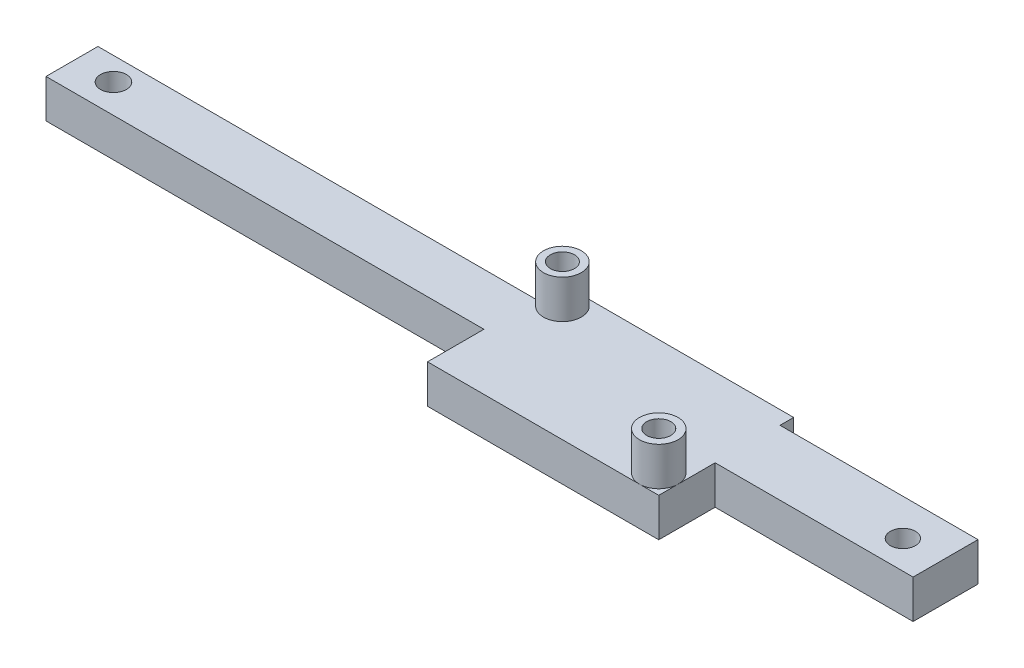
ISO-10303-21;
HEADER;
FILE_DESCRIPTION(('STEP AP214'),'2;1');
FILE_NAME('part.step','',(''),(''),'','','');
FILE_SCHEMA(('AUTOMOTIVE_DESIGN { 1 0 10303 214 1 1 1 1 }'));
ENDSEC;
DATA;
#1=APPLICATION_CONTEXT('core data for automotive mechanical design processes');
#2=APPLICATION_PROTOCOL_DEFINITION('international standard','automotive_design',2000,#1);
#3=PRODUCT_CONTEXT('',#1,'mechanical');
#4=PRODUCT('Part','Part','',(#3));
#5=PRODUCT_RELATED_PRODUCT_CATEGORY('part','',(#4));
#6=PRODUCT_DEFINITION_FORMATION('','',#4);
#7=PRODUCT_DEFINITION_CONTEXT('part definition',#1,'design');
#8=PRODUCT_DEFINITION('design','',#6,#7);
#9=PRODUCT_DEFINITION_SHAPE('','',#8);
#10=(LENGTH_UNIT() NAMED_UNIT(*) SI_UNIT(.MILLI.,.METRE.));
#11=(NAMED_UNIT(*) PLANE_ANGLE_UNIT() SI_UNIT($,.RADIAN.));
#12=(NAMED_UNIT(*) SI_UNIT($,.STERADIAN.) SOLID_ANGLE_UNIT());
#13=UNCERTAINTY_MEASURE_WITH_UNIT(LENGTH_MEASURE(1.E-05),#10,'distance_accuracy_value','');
#14=(GEOMETRIC_REPRESENTATION_CONTEXT(3) GLOBAL_UNCERTAINTY_ASSIGNED_CONTEXT((#13)) GLOBAL_UNIT_ASSIGNED_CONTEXT((#10,
#11,#12)) REPRESENTATION_CONTEXT('',''));
#15=CARTESIAN_POINT('',(0.,0.,0.));
#16=DIRECTION('',(0.,0.,1.));
#17=DIRECTION('',(1.,0.,0.));
#18=AXIS2_PLACEMENT_3D('',#15,#16,#17);
#19=CARTESIAN_POINT('',(-0.564642500860753,5.08,-0.133259911894273));
#20=DIRECTION('',(1.,0.,0.));
#21=DIRECTION('',(0.,0.,-1.));
#22=AXIS2_PLACEMENT_3D('',#19,#20,#21);
#23=PLANE('',#22);
#24=DIRECTION('',(0.,0.,1.));
#25=VECTOR('',#24,1.);
#26=CARTESIAN_POINT('',(-0.564642500860753,0.,-0.133259911894273));
#27=LINE('',#26,#25);
#28=CARTESIAN_POINT('',(-0.564642500860753,0.,-0.133259911894273));
#29=VERTEX_POINT('',#28);
#30=CARTESIAN_POINT('',(-0.564642500860753,0.,3.3674953541346));
#31=VERTEX_POINT('',#30);
#32=EDGE_CURVE('E251',#29,#31,#27,.T.);
#33=ORIENTED_EDGE('',*,*,#32,.T.);
#34=DIRECTION('',(0.,1.,0.));
#35=VECTOR('',#34,1.);
#36=CARTESIAN_POINT('',(-0.564642500860752,5.08,3.3674953541346));
#37=LINE('',#36,#35);
#38=CARTESIAN_POINT('',(-0.564642500860753,5.08,3.3674953541346));
#39=VERTEX_POINT('',#38);
#40=EDGE_CURVE('E181',#31,#39,#37,.T.);
#41=ORIENTED_EDGE('',*,*,#40,.T.);
#42=DIRECTION('',(0.,0.,1.));
#43=VECTOR('',#42,1.);
#44=CARTESIAN_POINT('',(-0.564642500860753,5.08,-0.133259911894273));
#45=LINE('',#44,#43);
#46=CARTESIAN_POINT('',(-0.564642500860753,5.08,-0.133259911894273));
#47=VERTEX_POINT('',#46);
#48=EDGE_CURVE('E237',#47,#39,#45,.T.);
#49=ORIENTED_EDGE('',*,*,#48,.F.);
#50=DIRECTION('',(0.,-1.,0.));
#51=VECTOR('',#50,1.);
#52=CARTESIAN_POINT('',(-0.564642500860753,5.08,-0.133259911894273));
#53=LINE('',#52,#51);
#54=EDGE_CURVE('E250',#47,#29,#53,.T.);
#55=ORIENTED_EDGE('',*,*,#54,.T.);
#56=EDGE_LOOP('',(#33,#41,#49,#55));
#57=FACE_BOUND('',#56,.T.);
#58=ADVANCED_FACE('F45',(#57),#23,.F.);
#59=CARTESIAN_POINT('',(29.9153574991392,5.08,-0.133259911894273));
#60=DIRECTION('',(-1.,0.,0.));
#61=DIRECTION('',(0.,0.,1.));
#62=AXIS2_PLACEMENT_3D('',#59,#60,#61);
#63=PLANE('',#62);
#64=DIRECTION('',(0.,0.,-1.));
#65=VECTOR('',#64,1.);
#66=CARTESIAN_POINT('',(29.9153574991392,5.08,-0.133259911894273));
#67=LINE('',#66,#65);
#68=CARTESIAN_POINT('',(29.9153574991392,5.08,1.66130114459378));
#69=VERTEX_POINT('',#68);
#70=CARTESIAN_POINT('',(29.9153574991392,5.08,-0.133259911894273));
#71=VERTEX_POINT('',#70);
#72=EDGE_CURVE('E70',#69,#71,#67,.T.);
#73=ORIENTED_EDGE('',*,*,#72,.F.);
#74=DIRECTION('',(0.,1.,0.));
#75=VECTOR('',#74,1.);
#76=CARTESIAN_POINT('',(29.9153574991392,0.,1.66130114459378));
#77=LINE('',#76,#75);
#78=CARTESIAN_POINT('',(29.9153574991392,0.,1.66130114459378));
#79=VERTEX_POINT('',#78);
#80=EDGE_CURVE('E209',#79,#69,#77,.T.);
#81=ORIENTED_EDGE('',*,*,#80,.F.);
#82=DIRECTION('',(0.,0.,-1.));
#83=VECTOR('',#82,1.);
#84=CARTESIAN_POINT('',(29.9153574991392,0.,-0.133259911894273));
#85=LINE('',#84,#83);
#86=CARTESIAN_POINT('',(29.9153574991392,0.,-0.133259911894273));
#87=VERTEX_POINT('',#86);
#88=EDGE_CURVE('E256',#79,#87,#85,.T.);
#89=ORIENTED_EDGE('',*,*,#88,.T.);
#90=DIRECTION('',(0.,-1.,0.));
#91=VECTOR('',#90,1.);
#92=CARTESIAN_POINT('',(29.9153574991392,5.08,-0.133259911894273));
#93=LINE('',#92,#91);
#94=EDGE_CURVE('E263',#71,#87,#93,.T.);
#95=ORIENTED_EDGE('',*,*,#94,.F.);
#96=EDGE_LOOP('',(#73,#81,#89,#95));
#97=FACE_BOUND('',#96,.T.);
#98=ADVANCED_FACE('F300',(#97),#63,.F.);
#99=CARTESIAN_POINT('',(0.,5.08,0.));
#100=DIRECTION('',(0.,1.,0.));
#101=DIRECTION('',(0.,0.,1.));
#102=AXIS2_PLACEMENT_3D('',#99,#100,#101);
#103=PLANE('',#102);
#104=CARTESIAN_POINT('',(27.3753574991392,5.08,15.1067400881057));
#105=DIRECTION('',(0.,1.,0.));
#106=DIRECTION('',(0.,0.,1.));
#107=AXIS2_PLACEMENT_3D('',#104,#105,#106);
#108=CIRCLE('',#107,2.54);
#109=CARTESIAN_POINT('',(27.3753574991392,5.08,17.6467400881057));
#110=VERTEX_POINT('',#109);
#111=CARTESIAN_POINT('',(29.9153574991392,5.08,15.1067400881057));
#112=VERTEX_POINT('',#111);
#113=EDGE_CURVE('E225',#110,#112,#108,.T.);
#114=ORIENTED_EDGE('',*,*,#113,.F.);
#115=DIRECTION('',(1.,0.,0.));
#116=VECTOR('',#115,1.);
#117=CARTESIAN_POINT('',(-0.564642500860751,5.08,17.6467400881057));
#118=LINE('',#117,#116);
#119=CARTESIAN_POINT('',(29.9153574991392,5.08,17.6467400881057));
#120=VERTEX_POINT('',#119);
#121=EDGE_CURVE('E240',#110,#120,#118,.T.);
#122=ORIENTED_EDGE('',*,*,#121,.T.);
#123=EDGE_CURVE('E244',#120,#112,#67,.T.);
#124=ORIENTED_EDGE('',*,*,#123,.T.);
#125=EDGE_LOOP('',(#114,#122,#124));
#126=FACE_BOUND('',#125,.T.);
#127=ADVANCED_FACE('F288',(#126),#103,.T.);
#128=CARTESIAN_POINT('',(-0.564642500860751,5.08,10.2150782238196));
#129=VERTEX_POINT('',#128);
#130=CARTESIAN_POINT('',(-0.564642500860751,5.08,17.6467400881057));
#131=VERTEX_POINT('',#130);
#132=EDGE_CURVE('E241',#129,#131,#45,.T.);
#133=ORIENTED_EDGE('',*,*,#132,.F.);
#134=DIRECTION('',(0.,-1.,0.));
#135=VECTOR('',#134,1.);
#136=CARTESIAN_POINT('',(-0.564642500860751,5.08,10.2150782238196));
#137=LINE('',#136,#135);
#138=CARTESIAN_POINT('',(-0.564642500860753,0.,10.2150782238196));
#139=VERTEX_POINT('',#138);
#140=EDGE_CURVE('E178',#129,#139,#137,.T.);
#141=ORIENTED_EDGE('',*,*,#140,.T.);
#142=CARTESIAN_POINT('',(-0.564642500860751,0.,17.6467400881057));
#143=VERTEX_POINT('',#142);
#144=EDGE_CURVE('E161',#139,#143,#27,.T.);
#145=ORIENTED_EDGE('',*,*,#144,.T.);
#146=DIRECTION('',(0.,-1.,0.));
#147=VECTOR('',#146,1.);
#148=CARTESIAN_POINT('',(-0.564642500860751,5.08,17.6467400881057));
#149=LINE('',#148,#147);
#150=EDGE_CURVE('E49',#131,#143,#149,.T.);
#151=ORIENTED_EDGE('',*,*,#150,.F.);
#152=EDGE_LOOP('',(#133,#141,#145,#151));
#153=FACE_BOUND('',#152,.T.);
#154=ADVANCED_FACE('F47',(#153),#23,.F.);
#155=CARTESIAN_POINT('',(-0.564642500860751,5.08,17.6467400881057));
#156=DIRECTION('',(0.,0.,-1.));
#157=DIRECTION('',(-1.,0.,0.));
#158=AXIS2_PLACEMENT_3D('',#155,#156,#157);
#159=PLANE('',#158);
#160=DIRECTION('',(1.,0.,0.));
#161=VECTOR('',#160,1.);
#162=CARTESIAN_POINT('',(-0.564642500860751,0.,17.6467400881057));
#163=LINE('',#162,#161);
#164=CARTESIAN_POINT('',(29.9153574991392,0.,17.6467400881057));
#165=VERTEX_POINT('',#164);
#166=EDGE_CURVE('E254',#143,#165,#163,.T.);
#167=ORIENTED_EDGE('',*,*,#166,.T.);
#168=DIRECTION('',(0.,-1.,0.));
#169=VECTOR('',#168,1.);
#170=CARTESIAN_POINT('',(29.9153574991392,5.08,17.6467400881057));
#171=LINE('',#170,#169);
#172=EDGE_CURVE('E265',#120,#165,#171,.T.);
#173=ORIENTED_EDGE('',*,*,#172,.F.);
#174=ORIENTED_EDGE('',*,*,#121,.F.);
#175=EDGE_CURVE('E242',#131,#110,#118,.T.);
#176=ORIENTED_EDGE('',*,*,#175,.F.);
#177=ORIENTED_EDGE('',*,*,#150,.T.);
#178=EDGE_LOOP('',(#167,#173,#174,#176,#177));
#179=FACE_BOUND('',#178,.T.);
#180=ADVANCED_FACE('F289',(#179),#159,.F.);
#181=CARTESIAN_POINT('',(29.9153574991392,0.,10.2150782238196));
#182=VERTEX_POINT('',#181);
#183=EDGE_CURVE('E257',#165,#182,#85,.T.);
#184=ORIENTED_EDGE('',*,*,#183,.T.);
#185=DIRECTION('',(0.,1.,0.));
#186=VECTOR('',#185,1.);
#187=CARTESIAN_POINT('',(29.9153574991392,0.,10.2150782238196));
#188=LINE('',#187,#186);
#189=CARTESIAN_POINT('',(29.9153574991392,5.08,10.2150782238196));
#190=VERTEX_POINT('',#189);
#191=EDGE_CURVE('E201',#182,#190,#188,.T.);
#192=ORIENTED_EDGE('',*,*,#191,.T.);
#193=EDGE_CURVE('E248',#112,#190,#67,.T.);
#194=ORIENTED_EDGE('',*,*,#193,.F.);
#195=ORIENTED_EDGE('',*,*,#123,.F.);
#196=ORIENTED_EDGE('',*,*,#172,.T.);
#197=EDGE_LOOP('',(#184,#192,#194,#195,#196));
#198=FACE_BOUND('',#197,.T.);
#199=ADVANCED_FACE('F285',(#198),#63,.F.);
#200=CARTESIAN_POINT('',(-0.564642500860753,5.08,-0.133259911894273));
#201=DIRECTION('',(0.,0.,1.));
#202=DIRECTION('',(1.,0.,0.));
#203=AXIS2_PLACEMENT_3D('',#200,#201,#202);
#204=PLANE('',#203);
#205=DIRECTION('',(-1.,0.,0.));
#206=VECTOR('',#205,1.);
#207=CARTESIAN_POINT('',(-0.564642500860753,0.,-0.133259911894273));
#208=LINE('',#207,#206);
#209=EDGE_CURVE('E259',#87,#29,#208,.T.);
#210=ORIENTED_EDGE('',*,*,#209,.T.);
#211=ORIENTED_EDGE('',*,*,#54,.F.);
#212=DIRECTION('',(-1.,0.,0.));
#213=VECTOR('',#212,1.);
#214=CARTESIAN_POINT('',(-0.564642500860753,5.08,-0.133259911894273));
#215=LINE('',#214,#213);
#216=EDGE_CURVE('E247',#71,#47,#215,.T.);
#217=ORIENTED_EDGE('',*,*,#216,.F.);
#218=ORIENTED_EDGE('',*,*,#94,.T.);
#219=EDGE_LOOP('',(#210,#211,#217,#218));
#220=FACE_BOUND('',#219,.T.);
#221=ADVANCED_FACE('F304',(#220),#204,.F.);
#222=ORIENTED_EDGE('',*,*,#48,.T.);
#223=DIRECTION('',(-1.,0.,0.));
#224=VECTOR('',#223,1.);
#225=CARTESIAN_POINT('',(-58.2895869948384,5.08,3.3674953541346));
#226=LINE('',#225,#224);
#227=CARTESIAN_POINT('',(-58.2895869948384,5.08,3.3674953541346));
#228=VERTEX_POINT('',#227);
#229=EDGE_CURVE('E166',#39,#228,#226,.T.);
#230=ORIENTED_EDGE('',*,*,#229,.T.);
#231=DIRECTION('',(0.,0.,1.));
#232=VECTOR('',#231,1.);
#233=CARTESIAN_POINT('',(-58.2895869948384,5.08,10.2150782238196));
#234=LINE('',#233,#232);
#235=CARTESIAN_POINT('',(-58.2895869948384,5.08,10.2150782238196));
#236=VERTEX_POINT('',#235);
#237=EDGE_CURVE('E174',#228,#236,#234,.T.);
#238=ORIENTED_EDGE('',*,*,#237,.T.);
#239=DIRECTION('',(1.,0.,0.));
#240=VECTOR('',#239,1.);
#241=CARTESIAN_POINT('',(-58.2895869948384,5.08,10.2150782238196));
#242=LINE('',#241,#240);
#243=EDGE_CURVE('E62',#236,#129,#242,.T.);
#244=ORIENTED_EDGE('',*,*,#243,.T.);
#245=ORIENTED_EDGE('',*,*,#132,.T.);
#246=ORIENTED_EDGE('',*,*,#175,.T.);
#247=EDGE_CURVE('E54',#112,#110,#108,.T.);
#248=ORIENTED_EDGE('',*,*,#247,.F.);
#249=ORIENTED_EDGE('',*,*,#193,.T.);
#250=DIRECTION('',(1.,0.,0.));
#251=VECTOR('',#250,1.);
#252=CARTESIAN_POINT('',(29.9153574991392,5.08,10.2150782238196));
#253=LINE('',#252,#251);
#254=CARTESIAN_POINT('',(56.0104130051616,5.08,10.2150782238196));
#255=VERTEX_POINT('',#254);
#256=EDGE_CURVE('E188',#190,#255,#253,.T.);
#257=ORIENTED_EDGE('',*,*,#256,.T.);
#258=DIRECTION('',(0.,0.,-1.));
#259=VECTOR('',#258,1.);
#260=CARTESIAN_POINT('',(56.0104130051616,5.08,10.2150782238196));
#261=LINE('',#260,#259);
#262=CARTESIAN_POINT('',(56.0104130051616,5.08,1.66130114459378));
#263=VERTEX_POINT('',#262);
#264=EDGE_CURVE('E204',#255,#263,#261,.T.);
#265=ORIENTED_EDGE('',*,*,#264,.T.);
#266=DIRECTION('',(-1.,0.,0.));
#267=VECTOR('',#266,1.);
#268=CARTESIAN_POINT('',(29.9153574991392,5.08,1.66130114459378));
#269=LINE('',#268,#267);
#270=EDGE_CURVE('E195',#263,#69,#269,.T.);
#271=ORIENTED_EDGE('',*,*,#270,.T.);
#272=ORIENTED_EDGE('',*,*,#72,.T.);
#273=ORIENTED_EDGE('',*,*,#216,.T.);
#274=EDGE_LOOP('',(#222,#230,#238,#244,#245,#246,#248,#249,#257,#265,#271,#272,#273));
#275=FACE_BOUND('',#274,.T.);
#276=CARTESIAN_POINT('',(1.97535749913925,5.08,2.40674008810573));
#277=DIRECTION('',(0.,1.,0.));
#278=DIRECTION('',(0.,0.,1.));
#279=AXIS2_PLACEMENT_3D('',#276,#277,#278);
#280=CIRCLE('',#279,2.49662308483472);
#281=CARTESIAN_POINT('',(1.97535749913925,5.08,4.90336317294045));
#282=VERTEX_POINT('',#281);
#283=EDGE_CURVE('E11',#282,#282,#280,.T.);
#284=ORIENTED_EDGE('',*,*,#283,.F.);
#285=EDGE_LOOP('',(#284));
#286=FACE_BOUND('',#285,.T.);
#287=CARTESIAN_POINT('',(50.9304130051616,5.08,6.48414556415878));
#288=DIRECTION('',(0.,1.,0.));
#289=DIRECTION('',(0.,0.,1.));
#290=AXIS2_PLACEMENT_3D('',#287,#288,#289);
#291=CIRCLE('',#290,1.64639839921899);
#292=CARTESIAN_POINT('',(50.9304130051616,5.08,8.13054396337777));
#293=VERTEX_POINT('',#292);
#294=EDGE_CURVE('E184',#293,#293,#291,.T.);
#295=ORIENTED_EDGE('',*,*,#294,.F.);
#296=EDGE_LOOP('',(#295));
#297=FACE_BOUND('',#296,.T.);
#298=CARTESIAN_POINT('',(-53.2095869948384,5.08,6.40507822381963));
#299=DIRECTION('',(0.,1.,0.));
#300=DIRECTION('',(0.,0.,1.));
#301=AXIS2_PLACEMENT_3D('',#298,#299,#300);
#302=CIRCLE('',#301,1.70911950139234);
#303=CARTESIAN_POINT('',(-53.2095869948384,5.08,8.11419772521197));
#304=VERTEX_POINT('',#303);
#305=EDGE_CURVE('E170',#304,#304,#302,.T.);
#306=ORIENTED_EDGE('',*,*,#305,.F.);
#307=EDGE_LOOP('',(#306));
#308=FACE_BOUND('',#307,.T.);
#309=ADVANCED_FACE('F281',(#275,#286,#297,#308),#103,.T.);
#310=CARTESIAN_POINT('',(0.,0.,0.));
#311=DIRECTION('',(0.,1.,0.));
#312=DIRECTION('',(0.,0.,1.));
#313=AXIS2_PLACEMENT_3D('',#310,#311,#312);
#314=PLANE('',#313);
#315=ORIENTED_EDGE('',*,*,#144,.F.);
#316=DIRECTION('',(1.,0.,0.));
#317=VECTOR('',#316,1.);
#318=CARTESIAN_POINT('',(-58.2895869948384,0.,10.2150782238196));
#319=LINE('',#318,#317);
#320=CARTESIAN_POINT('',(-58.2895869948384,0.,10.2150782238196));
#321=VERTEX_POINT('',#320);
#322=EDGE_CURVE('E145',#321,#139,#319,.T.);
#323=ORIENTED_EDGE('',*,*,#322,.F.);
#324=DIRECTION('',(0.,0.,1.));
#325=VECTOR('',#324,1.);
#326=CARTESIAN_POINT('',(-58.2895869948384,0.,10.2150782238196));
#327=LINE('',#326,#325);
#328=CARTESIAN_POINT('',(-58.2895869948384,0.,3.3674953541346));
#329=VERTEX_POINT('',#328);
#330=EDGE_CURVE('E159',#329,#321,#327,.T.);
#331=ORIENTED_EDGE('',*,*,#330,.F.);
#332=DIRECTION('',(-1.,0.,0.));
#333=VECTOR('',#332,1.);
#334=CARTESIAN_POINT('',(-58.2895869948384,0.,3.3674953541346));
#335=LINE('',#334,#333);
#336=EDGE_CURVE('E151',#31,#329,#335,.T.);
#337=ORIENTED_EDGE('',*,*,#336,.F.);
#338=ORIENTED_EDGE('',*,*,#32,.F.);
#339=ORIENTED_EDGE('',*,*,#209,.F.);
#340=ORIENTED_EDGE('',*,*,#88,.F.);
#341=DIRECTION('',(-1.,0.,0.));
#342=VECTOR('',#341,1.);
#343=CARTESIAN_POINT('',(29.9153574991392,0.,1.66130114459378));
#344=LINE('',#343,#342);
#345=CARTESIAN_POINT('',(56.0104130051616,0.,1.66130114459378));
#346=VERTEX_POINT('',#345);
#347=EDGE_CURVE('E198',#346,#79,#344,.T.);
#348=ORIENTED_EDGE('',*,*,#347,.F.);
#349=DIRECTION('',(0.,0.,-1.));
#350=VECTOR('',#349,1.);
#351=CARTESIAN_POINT('',(56.0104130051616,0.,10.2150782238196));
#352=LINE('',#351,#350);
#353=CARTESIAN_POINT('',(56.0104130051616,0.,10.2150782238196));
#354=VERTEX_POINT('',#353);
#355=EDGE_CURVE('E194',#354,#346,#352,.T.);
#356=ORIENTED_EDGE('',*,*,#355,.F.);
#357=DIRECTION('',(1.,0.,0.));
#358=VECTOR('',#357,1.);
#359=CARTESIAN_POINT('',(29.9153574991392,0.,10.2150782238196));
#360=LINE('',#359,#358);
#361=EDGE_CURVE('E191',#182,#354,#360,.T.);
#362=ORIENTED_EDGE('',*,*,#361,.F.);
#363=ORIENTED_EDGE('',*,*,#183,.F.);
#364=ORIENTED_EDGE('',*,*,#166,.F.);
#365=EDGE_LOOP('',(#315,#323,#331,#337,#338,#339,#340,#348,#356,#362,#363,#364));
#366=FACE_BOUND('',#365,.T.);
#367=CARTESIAN_POINT('',(1.97535749913925,0.,2.40674008810573));
#368=DIRECTION('',(0.,1.,0.));
#369=DIRECTION('',(0.,0.,1.));
#370=AXIS2_PLACEMENT_3D('',#367,#368,#369);
#371=CIRCLE('',#370,1.5875);
#372=CARTESIAN_POINT('',(1.97535749913925,0.,3.99424008810573));
#373=VERTEX_POINT('',#372);
#374=EDGE_CURVE('E232',#373,#373,#371,.T.);
#375=ORIENTED_EDGE('',*,*,#374,.T.);
#376=EDGE_LOOP('',(#375));
#377=FACE_BOUND('',#376,.T.);
#378=CARTESIAN_POINT('',(27.3753574991392,0.,15.1067400881057));
#379=DIRECTION('',(0.,1.,0.));
#380=DIRECTION('',(0.,0.,1.));
#381=AXIS2_PLACEMENT_3D('',#378,#379,#380);
#382=CIRCLE('',#381,1.5875);
#383=CARTESIAN_POINT('',(27.3753574991392,0.,16.6942400881057));
#384=VERTEX_POINT('',#383);
#385=EDGE_CURVE('E223',#384,#384,#382,.T.);
#386=ORIENTED_EDGE('',*,*,#385,.T.);
#387=EDGE_LOOP('',(#386));
#388=FACE_BOUND('',#387,.T.);
#389=CARTESIAN_POINT('',(50.9304130051616,0.,6.48414556415878));
#390=DIRECTION('',(0.,1.,0.));
#391=DIRECTION('',(0.,0.,1.));
#392=AXIS2_PLACEMENT_3D('',#389,#390,#391);
#393=CIRCLE('',#392,1.64639839921899);
#394=CARTESIAN_POINT('',(50.9304130051616,0.,8.13054396337777));
#395=VERTEX_POINT('',#394);
#396=EDGE_CURVE('E185',#395,#395,#393,.T.);
#397=ORIENTED_EDGE('',*,*,#396,.T.);
#398=EDGE_LOOP('',(#397));
#399=FACE_BOUND('',#398,.T.);
#400=CARTESIAN_POINT('',(-53.2095869948384,0.,6.40507822381963));
#401=DIRECTION('',(0.,1.,0.));
#402=DIRECTION('',(0.,0.,1.));
#403=AXIS2_PLACEMENT_3D('',#400,#401,#402);
#404=CIRCLE('',#403,1.70911950139234);
#405=CARTESIAN_POINT('',(-53.2095869948384,0.,8.11419772521197));
#406=VERTEX_POINT('',#405);
#407=EDGE_CURVE('E176',#406,#406,#404,.T.);
#408=ORIENTED_EDGE('',*,*,#407,.T.);
#409=EDGE_LOOP('',(#408));
#410=FACE_BOUND('',#409,.T.);
#411=ADVANCED_FACE('F156',(#366,#377,#388,#399,#410),#314,.F.);
#412=CARTESIAN_POINT('',(27.3753574991392,0.,15.1067400881057));
#413=DIRECTION('',(0.,1.,0.));
#414=DIRECTION('',(0.,0.,1.));
#415=AXIS2_PLACEMENT_3D('',#412,#413,#414);
#416=CYLINDRICAL_SURFACE('',#415,1.5875);
#417=ORIENTED_EDGE('',*,*,#385,.F.);
#418=EDGE_LOOP('',(#417));
#419=FACE_BOUND('',#418,.T.);
#420=CARTESIAN_POINT('',(27.3753574991392,10.16,15.1067400881057));
#421=DIRECTION('',(0.,1.,0.));
#422=DIRECTION('',(0.,0.,1.));
#423=AXIS2_PLACEMENT_3D('',#420,#421,#422);
#424=CIRCLE('',#423,1.5875);
#425=CARTESIAN_POINT('',(27.3753574991392,10.16,16.6942400881057));
#426=VERTEX_POINT('',#425);
#427=EDGE_CURVE('E221',#426,#426,#424,.T.);
#428=ORIENTED_EDGE('',*,*,#427,.T.);
#429=EDGE_LOOP('',(#428));
#430=FACE_BOUND('',#429,.T.);
#431=ADVANCED_FACE('F345',(#419,#430),#416,.F.);
#432=CARTESIAN_POINT('',(1.97535749913925,0.,2.40674008810573));
#433=DIRECTION('',(0.,1.,0.));
#434=DIRECTION('',(0.,0.,1.));
#435=AXIS2_PLACEMENT_3D('',#432,#433,#434);
#436=CYLINDRICAL_SURFACE('',#435,1.5875);
#437=ORIENTED_EDGE('',*,*,#374,.F.);
#438=EDGE_LOOP('',(#437));
#439=FACE_BOUND('',#438,.T.);
#440=CARTESIAN_POINT('',(1.97535749913925,10.16,2.40674008810573));
#441=DIRECTION('',(0.,1.,0.));
#442=DIRECTION('',(0.,0.,1.));
#443=AXIS2_PLACEMENT_3D('',#440,#441,#442);
#444=CIRCLE('',#443,1.5875);
#445=CARTESIAN_POINT('',(1.97535749913925,10.16,3.99424008810573));
#446=VERTEX_POINT('',#445);
#447=EDGE_CURVE('E217',#446,#446,#444,.T.);
#448=ORIENTED_EDGE('',*,*,#447,.T.);
#449=EDGE_LOOP('',(#448));
#450=FACE_BOUND('',#449,.T.);
#451=ADVANCED_FACE('F453',(#439,#450),#436,.F.);
#452=CARTESIAN_POINT('',(27.3753574991392,10.16,15.1067400881057));
#453=DIRECTION('',(0.,1.,0.));
#454=DIRECTION('',(0.,0.,1.));
#455=AXIS2_PLACEMENT_3D('',#452,#453,#454);
#456=PLANE('',#455);
#457=CARTESIAN_POINT('',(27.3753574991392,10.16,15.1067400881057));
#458=DIRECTION('',(0.,1.,0.));
#459=DIRECTION('',(0.,0.,1.));
#460=AXIS2_PLACEMENT_3D('',#457,#458,#459);
#461=CIRCLE('',#460,2.54);
#462=CARTESIAN_POINT('',(27.3753574991392,10.16,17.6467400881057));
#463=VERTEX_POINT('',#462);
#464=EDGE_CURVE('E211',#463,#463,#461,.T.);
#465=ORIENTED_EDGE('',*,*,#464,.T.);
#466=EDGE_LOOP('',(#465));
#467=FACE_BOUND('',#466,.T.);
#468=ORIENTED_EDGE('',*,*,#427,.F.);
#469=EDGE_LOOP('',(#468));
#470=FACE_BOUND('',#469,.T.);
#471=ADVANCED_FACE('F449',(#467,#470),#456,.T.);
#472=CARTESIAN_POINT('',(27.3753574991392,10.16,15.1067400881057));
#473=DIRECTION('',(0.,-1.,0.));
#474=DIRECTION('',(0.,0.,-1.));
#475=AXIS2_PLACEMENT_3D('',#472,#473,#474);
#476=CYLINDRICAL_SURFACE('',#475,2.54);
#477=ORIENTED_EDGE('',*,*,#464,.F.);
#478=EDGE_LOOP('',(#477));
#479=FACE_BOUND('',#478,.T.);
#480=ORIENTED_EDGE('',*,*,#113,.T.);
#481=ORIENTED_EDGE('',*,*,#247,.T.);
#482=EDGE_LOOP('',(#480,#481));
#483=FACE_BOUND('',#482,.T.);
#484=ADVANCED_FACE('F277',(#479,#483),#476,.T.);
#485=CARTESIAN_POINT('',(1.97535749913925,10.16,2.40674008810573));
#486=DIRECTION('',(0.,1.,0.));
#487=DIRECTION('',(0.,0.,1.));
#488=AXIS2_PLACEMENT_3D('',#485,#486,#487);
#489=PLANE('',#488);
#490=CARTESIAN_POINT('',(1.97535749913925,10.16,2.40674008810573));
#491=DIRECTION('',(0.,1.,0.));
#492=DIRECTION('',(0.,0.,1.));
#493=AXIS2_PLACEMENT_3D('',#490,#491,#492);
#494=CIRCLE('',#493,2.49662308483472);
#495=CARTESIAN_POINT('',(1.97535749913925,10.16,4.90336317294045));
#496=VERTEX_POINT('',#495);
#497=EDGE_CURVE('E220',#496,#496,#494,.T.);
#498=ORIENTED_EDGE('',*,*,#497,.T.);
#499=EDGE_LOOP('',(#498));
#500=FACE_BOUND('',#499,.T.);
#501=ORIENTED_EDGE('',*,*,#447,.F.);
#502=EDGE_LOOP('',(#501));
#503=FACE_BOUND('',#502,.T.);
#504=ADVANCED_FACE('F442',(#500,#503),#489,.T.);
#505=CARTESIAN_POINT('',(1.97535749913925,10.16,2.40674008810573));
#506=DIRECTION('',(0.,-1.,0.));
#507=DIRECTION('',(0.,0.,-1.));
#508=AXIS2_PLACEMENT_3D('',#505,#506,#507);
#509=CYLINDRICAL_SURFACE('',#508,2.49662308483472);
#510=ORIENTED_EDGE('',*,*,#497,.F.);
#511=EDGE_LOOP('',(#510));
#512=FACE_BOUND('',#511,.T.);
#513=ORIENTED_EDGE('',*,*,#283,.T.);
#514=EDGE_LOOP('',(#513));
#515=FACE_BOUND('',#514,.T.);
#516=ADVANCED_FACE('F364',(#512,#515),#509,.T.);
#517=CARTESIAN_POINT('',(29.9153574991392,0.,1.66130114459378));
#518=DIRECTION('',(0.,0.,-1.));
#519=DIRECTION('',(-1.,0.,0.));
#520=AXIS2_PLACEMENT_3D('',#517,#518,#519);
#521=PLANE('',#520);
#522=ORIENTED_EDGE('',*,*,#270,.F.);
#523=DIRECTION('',(0.,1.,0.));
#524=VECTOR('',#523,1.);
#525=CARTESIAN_POINT('',(56.0104130051616,0.,1.66130114459378));
#526=LINE('',#525,#524);
#527=EDGE_CURVE('E212',#346,#263,#526,.T.);
#528=ORIENTED_EDGE('',*,*,#527,.F.);
#529=ORIENTED_EDGE('',*,*,#347,.T.);
#530=ORIENTED_EDGE('',*,*,#80,.T.);
#531=EDGE_LOOP('',(#522,#528,#529,#530));
#532=FACE_BOUND('',#531,.T.);
#533=ADVANCED_FACE('F298',(#532),#521,.T.);
#534=CARTESIAN_POINT('',(56.0104130051616,0.,10.2150782238196));
#535=DIRECTION('',(1.,0.,0.));
#536=DIRECTION('',(0.,0.,-1.));
#537=AXIS2_PLACEMENT_3D('',#534,#535,#536);
#538=PLANE('',#537);
#539=ORIENTED_EDGE('',*,*,#264,.F.);
#540=DIRECTION('',(0.,1.,0.));
#541=VECTOR('',#540,1.);
#542=CARTESIAN_POINT('',(56.0104130051616,0.,10.2150782238196));
#543=LINE('',#542,#541);
#544=EDGE_CURVE('E214',#354,#255,#543,.T.);
#545=ORIENTED_EDGE('',*,*,#544,.F.);
#546=ORIENTED_EDGE('',*,*,#355,.T.);
#547=ORIENTED_EDGE('',*,*,#527,.T.);
#548=EDGE_LOOP('',(#539,#545,#546,#547));
#549=FACE_BOUND('',#548,.T.);
#550=ADVANCED_FACE('F363',(#549),#538,.T.);
#551=CARTESIAN_POINT('',(29.9153574991392,0.,10.2150782238196));
#552=DIRECTION('',(0.,0.,1.));
#553=DIRECTION('',(1.,0.,0.));
#554=AXIS2_PLACEMENT_3D('',#551,#552,#553);
#555=PLANE('',#554);
#556=ORIENTED_EDGE('',*,*,#256,.F.);
#557=ORIENTED_EDGE('',*,*,#191,.F.);
#558=ORIENTED_EDGE('',*,*,#361,.T.);
#559=ORIENTED_EDGE('',*,*,#544,.T.);
#560=EDGE_LOOP('',(#556,#557,#558,#559));
#561=FACE_BOUND('',#560,.T.);
#562=ADVANCED_FACE('F293',(#561),#555,.T.);
#563=CARTESIAN_POINT('',(50.9304130051616,0.,6.48414556415878));
#564=DIRECTION('',(0.,1.,0.));
#565=DIRECTION('',(0.,0.,1.));
#566=AXIS2_PLACEMENT_3D('',#563,#564,#565);
#567=CYLINDRICAL_SURFACE('',#566,1.64639839921899);
#568=ORIENTED_EDGE('',*,*,#396,.F.);
#569=EDGE_LOOP('',(#568));
#570=FACE_BOUND('',#569,.T.);
#571=ORIENTED_EDGE('',*,*,#294,.T.);
#572=EDGE_LOOP('',(#571));
#573=FACE_BOUND('',#572,.T.);
#574=ADVANCED_FACE('F312',(#570,#573),#567,.F.);
#575=CARTESIAN_POINT('',(-58.2895869948384,0.,3.3674953541346));
#576=DIRECTION('',(0.,0.,-1.));
#577=DIRECTION('',(-1.,0.,0.));
#578=AXIS2_PLACEMENT_3D('',#575,#576,#577);
#579=PLANE('',#578);
#580=ORIENTED_EDGE('',*,*,#40,.F.);
#581=ORIENTED_EDGE('',*,*,#336,.T.);
#582=DIRECTION('',(0.,1.,0.));
#583=VECTOR('',#582,1.);
#584=CARTESIAN_POINT('',(-58.2895869948384,0.,3.3674953541346));
#585=LINE('',#584,#583);
#586=EDGE_CURVE('E150',#329,#228,#585,.T.);
#587=ORIENTED_EDGE('',*,*,#586,.T.);
#588=ORIENTED_EDGE('',*,*,#229,.F.);
#589=EDGE_LOOP('',(#580,#581,#587,#588));
#590=FACE_BOUND('',#589,.T.);
#591=ADVANCED_FACE('F310',(#590),#579,.T.);
#592=CARTESIAN_POINT('',(-58.2895869948384,0.,10.2150782238196));
#593=DIRECTION('',(0.,0.,1.));
#594=DIRECTION('',(1.,0.,0.));
#595=AXIS2_PLACEMENT_3D('',#592,#593,#594);
#596=PLANE('',#595);
#597=ORIENTED_EDGE('',*,*,#140,.F.);
#598=ORIENTED_EDGE('',*,*,#243,.F.);
#599=DIRECTION('',(0.,1.,0.));
#600=VECTOR('',#599,1.);
#601=CARTESIAN_POINT('',(-58.2895869948384,0.,10.2150782238196));
#602=LINE('',#601,#600);
#603=EDGE_CURVE('E142',#321,#236,#602,.T.);
#604=ORIENTED_EDGE('',*,*,#603,.F.);
#605=ORIENTED_EDGE('',*,*,#322,.T.);
#606=EDGE_LOOP('',(#597,#598,#604,#605));
#607=FACE_BOUND('',#606,.T.);
#608=ADVANCED_FACE('F144',(#607),#596,.T.);
#609=CARTESIAN_POINT('',(-58.2895869948384,0.,10.2150782238196));
#610=DIRECTION('',(-1.,0.,0.));
#611=DIRECTION('',(0.,0.,1.));
#612=AXIS2_PLACEMENT_3D('',#609,#610,#611);
#613=PLANE('',#612);
#614=ORIENTED_EDGE('',*,*,#237,.F.);
#615=ORIENTED_EDGE('',*,*,#586,.F.);
#616=ORIENTED_EDGE('',*,*,#330,.T.);
#617=ORIENTED_EDGE('',*,*,#603,.T.);
#618=EDGE_LOOP('',(#614,#615,#616,#617));
#619=FACE_BOUND('',#618,.T.);
#620=ADVANCED_FACE('F164',(#619),#613,.T.);
#621=CARTESIAN_POINT('',(-53.2095869948384,0.,6.40507822381963));
#622=DIRECTION('',(0.,1.,0.));
#623=DIRECTION('',(0.,0.,1.));
#624=AXIS2_PLACEMENT_3D('',#621,#622,#623);
#625=CYLINDRICAL_SURFACE('',#624,1.70911950139234);
#626=ORIENTED_EDGE('',*,*,#407,.F.);
#627=EDGE_LOOP('',(#626));
#628=FACE_BOUND('',#627,.T.);
#629=ORIENTED_EDGE('',*,*,#305,.T.);
#630=EDGE_LOOP('',(#629));
#631=FACE_BOUND('',#630,.T.);
#632=ADVANCED_FACE('F423',(#628,#631),#625,.F.);
#633=CLOSED_SHELL('',(#58,#98,#127,#154,#180,#199,#221,#309,#411,#431,#451,#471,#484,#504,#516,
#533,#550,#562,#574,#591,#608,#620,#632));
#634=MANIFOLD_SOLID_BREP('B2',#633);
#635=ADVANCED_BREP_SHAPE_REPRESENTATION('',(#18,#634),#14);
#636=SHAPE_DEFINITION_REPRESENTATION(#9,#635);
ENDSEC;
END-ISO-10303-21;
